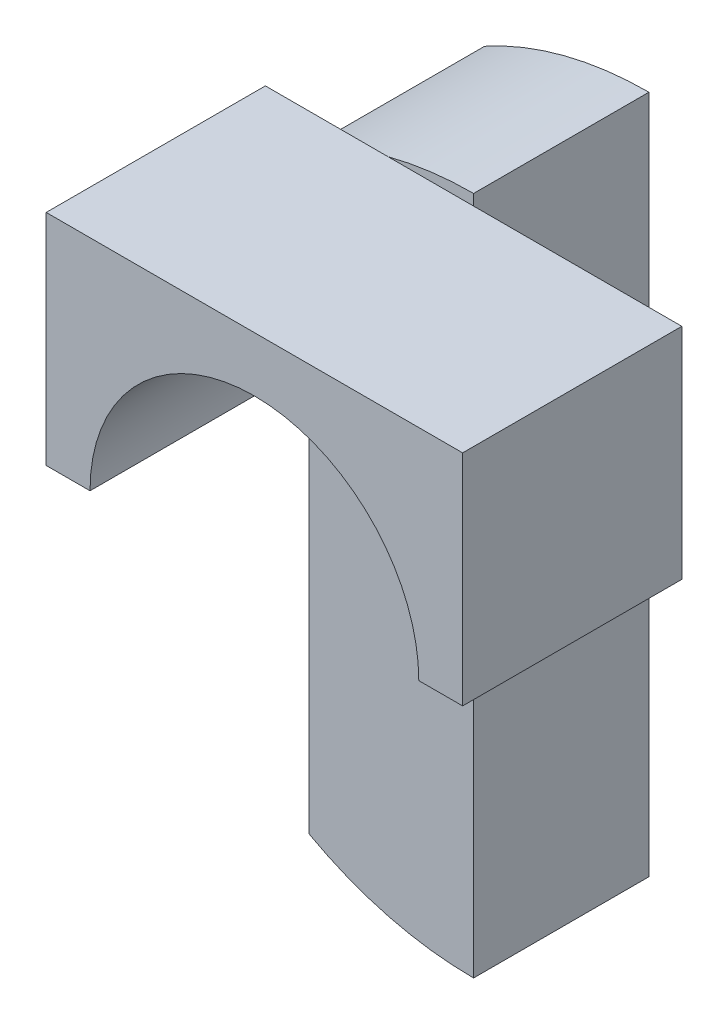
ISO-10303-21;
HEADER;
FILE_DESCRIPTION(('STEP AP214'),'2;1');
FILE_NAME('part.step','',(''),(''),'','','');
FILE_SCHEMA(('AUTOMOTIVE_DESIGN { 1 0 10303 214 1 1 1 1 }'));
ENDSEC;
DATA;
#1=APPLICATION_CONTEXT('core data for automotive mechanical design processes');
#2=APPLICATION_PROTOCOL_DEFINITION('international standard','automotive_design',2000,#1);
#3=PRODUCT_CONTEXT('',#1,'mechanical');
#4=PRODUCT('Part','Part','',(#3));
#5=PRODUCT_RELATED_PRODUCT_CATEGORY('part','',(#4));
#6=PRODUCT_DEFINITION_FORMATION('','',#4);
#7=PRODUCT_DEFINITION_CONTEXT('part definition',#1,'design');
#8=PRODUCT_DEFINITION('design','',#6,#7);
#9=PRODUCT_DEFINITION_SHAPE('','',#8);
#10=(LENGTH_UNIT() NAMED_UNIT(*) SI_UNIT(.MILLI.,.METRE.));
#11=(NAMED_UNIT(*) PLANE_ANGLE_UNIT() SI_UNIT($,.RADIAN.));
#12=(NAMED_UNIT(*) SI_UNIT($,.STERADIAN.) SOLID_ANGLE_UNIT());
#13=UNCERTAINTY_MEASURE_WITH_UNIT(LENGTH_MEASURE(1.E-05),#10,'distance_accuracy_value','');
#14=(GEOMETRIC_REPRESENTATION_CONTEXT(3) GLOBAL_UNCERTAINTY_ASSIGNED_CONTEXT((#13)) GLOBAL_UNIT_ASSIGNED_CONTEXT((#10,
#11,#12)) REPRESENTATION_CONTEXT('',''));
#15=CARTESIAN_POINT('',(0.,0.,0.));
#16=DIRECTION('',(0.,0.,1.));
#17=DIRECTION('',(1.,0.,0.));
#18=AXIS2_PLACEMENT_3D('',#15,#16,#17);
#19=CARTESIAN_POINT('',(0.,0.,8.));
#20=DIRECTION('',(0.,0.,1.));
#21=DIRECTION('',(1.,0.,0.));
#22=AXIS2_PLACEMENT_3D('',#19,#20,#21);
#23=PLANE('',#22);
#24=CARTESIAN_POINT('',(0.,5.,8.));
#25=DIRECTION('',(0.,0.,-1.));
#26=DIRECTION('',(1.,0.,0.));
#27=AXIS2_PLACEMENT_3D('',#24,#25,#26);
#28=CIRCLE('',#27,7.50000000000001);
#29=CARTESIAN_POINT('',(-7.50000000000001,5.,8.));
#30=VERTEX_POINT('',#29);
#31=CARTESIAN_POINT('',(0.,12.5,8.));
#32=VERTEX_POINT('',#31);
#33=EDGE_CURVE('E202',#30,#32,#28,.T.);
#34=ORIENTED_EDGE('',*,*,#33,.F.);
#35=DIRECTION('',(0.,-1.,0.));
#36=VECTOR('',#35,1.);
#37=CARTESIAN_POINT('',(-7.50000000000001,13.5646599662505,8.));
#38=LINE('',#37,#36);
#39=CARTESIAN_POINT('',(-7.50000000000001,-13.5646599662505,8.));
#40=VERTEX_POINT('',#39);
#41=EDGE_CURVE('E158',#30,#40,#38,.T.);
#42=ORIENTED_EDGE('',*,*,#41,.T.);
#43=CARTESIAN_POINT('',(0.,0.,8.));
#44=DIRECTION('',(0.,0.,1.));
#45=DIRECTION('',(1.,0.,0.));
#46=AXIS2_PLACEMENT_3D('',#43,#44,#45);
#47=CIRCLE('',#46,15.5);
#48=CARTESIAN_POINT('',(1.62353882256206E-13,-15.5,8.));
#49=VERTEX_POINT('',#48);
#50=EDGE_CURVE('E163',#40,#49,#47,.T.);
#51=ORIENTED_EDGE('',*,*,#50,.T.);
#52=DIRECTION('',(0.,1.,0.));
#53=VECTOR('',#52,1.);
#54=CARTESIAN_POINT('',(0.,15.5,8.));
#55=LINE('',#54,#53);
#56=EDGE_CURVE('E166',#49,#32,#55,.T.);
#57=ORIENTED_EDGE('',*,*,#56,.T.);
#58=EDGE_LOOP('',(#34,#42,#51,#57));
#59=FACE_BOUND('',#58,.T.);
#60=ADVANCED_FACE('F33',(#59),#23,.T.);
#61=CARTESIAN_POINT('',(0.,0.,8.));
#62=DIRECTION('',(0.,0.,-1.));
#63=DIRECTION('',(-1.,0.,0.));
#64=AXIS2_PLACEMENT_3D('',#61,#62,#63);
#65=CYLINDRICAL_SURFACE('',#64,15.5);
#66=CARTESIAN_POINT('',(0.,0.,0.));
#67=DIRECTION('',(0.,0.,1.));
#68=DIRECTION('',(1.,0.,0.));
#69=AXIS2_PLACEMENT_3D('',#66,#67,#68);
#70=CIRCLE('',#69,15.5);
#71=CARTESIAN_POINT('',(0.,15.5,0.));
#72=VERTEX_POINT('',#71);
#73=CARTESIAN_POINT('',(-7.50000000000001,13.5646599662505,0.));
#74=VERTEX_POINT('',#73);
#75=EDGE_CURVE('E147',#72,#74,#70,.T.);
#76=ORIENTED_EDGE('',*,*,#75,.T.);
#77=DIRECTION('',(0.,0.,-1.));
#78=VECTOR('',#77,1.);
#79=CARTESIAN_POINT('',(-7.50000000000001,13.5646599662505,8.));
#80=LINE('',#79,#78);
#81=CARTESIAN_POINT('',(-7.50000000000001,13.5646599662505,8.));
#82=VERTEX_POINT('',#81);
#83=EDGE_CURVE('E37',#82,#74,#80,.T.);
#84=ORIENTED_EDGE('',*,*,#83,.F.);
#85=CARTESIAN_POINT('',(0.,0.,8.));
#86=DIRECTION('',(0.,0.,1.));
#87=DIRECTION('',(1.,0.,0.));
#88=AXIS2_PLACEMENT_3D('',#85,#86,#87);
#89=CIRCLE('',#88,15.5);
#90=CARTESIAN_POINT('',(-3.90512483795332,15.,8.));
#91=VERTEX_POINT('',#90);
#92=EDGE_CURVE('E159',#91,#82,#89,.T.);
#93=ORIENTED_EDGE('',*,*,#92,.F.);
#94=CARTESIAN_POINT('',(0.,15.5,8.));
#95=VERTEX_POINT('',#94);
#96=EDGE_CURVE('E156',#95,#91,#89,.T.);
#97=ORIENTED_EDGE('',*,*,#96,.F.);
#98=DIRECTION('',(0.,0.,-1.));
#99=VECTOR('',#98,1.);
#100=CARTESIAN_POINT('',(0.,15.5,8.));
#101=LINE('',#100,#99);
#102=EDGE_CURVE('E167',#95,#72,#101,.T.);
#103=ORIENTED_EDGE('',*,*,#102,.T.);
#104=EDGE_LOOP('',(#76,#84,#93,#97,#103));
#105=FACE_BOUND('',#104,.T.);
#106=ADVANCED_FACE('F35',(#105),#65,.T.);
#107=CARTESIAN_POINT('',(-7.50000000000001,13.5646599662505,8.));
#108=DIRECTION('',(1.,0.,0.));
#109=DIRECTION('',(0.,0.,-1.));
#110=AXIS2_PLACEMENT_3D('',#107,#108,#109);
#111=PLANE('',#110);
#112=DIRECTION('',(0.,-1.,0.));
#113=VECTOR('',#112,1.);
#114=CARTESIAN_POINT('',(-7.50000000000001,13.5646599662505,0.));
#115=LINE('',#114,#113);
#116=CARTESIAN_POINT('',(-7.50000000000001,-13.5646599662505,0.));
#117=VERTEX_POINT('',#116);
#118=EDGE_CURVE('E150',#74,#117,#115,.T.);
#119=ORIENTED_EDGE('',*,*,#118,.T.);
#120=DIRECTION('',(0.,0.,-1.));
#121=VECTOR('',#120,1.);
#122=CARTESIAN_POINT('',(-7.50000000000001,-13.5646599662505,8.));
#123=LINE('',#122,#121);
#124=EDGE_CURVE('E178',#40,#117,#123,.T.);
#125=ORIENTED_EDGE('',*,*,#124,.F.);
#126=ORIENTED_EDGE('',*,*,#41,.F.);
#127=EDGE_CURVE('E160',#82,#30,#38,.T.);
#128=ORIENTED_EDGE('',*,*,#127,.F.);
#129=ORIENTED_EDGE('',*,*,#83,.T.);
#130=EDGE_LOOP('',(#119,#125,#126,#128,#129));
#131=FACE_BOUND('',#130,.T.);
#132=ADVANCED_FACE('F187',(#131),#111,.F.);
#133=CARTESIAN_POINT('',(0.,0.,8.));
#134=DIRECTION('',(0.,0.,-1.));
#135=DIRECTION('',(-1.,0.,0.));
#136=AXIS2_PLACEMENT_3D('',#133,#134,#135);
#137=CYLINDRICAL_SURFACE('',#136,15.5);
#138=CARTESIAN_POINT('',(0.,0.,0.));
#139=DIRECTION('',(0.,0.,1.));
#140=DIRECTION('',(1.,0.,0.));
#141=AXIS2_PLACEMENT_3D('',#138,#139,#140);
#142=CIRCLE('',#141,15.5);
#143=CARTESIAN_POINT('',(1.62353882256206E-13,-15.5,0.));
#144=VERTEX_POINT('',#143);
#145=EDGE_CURVE('E170',#117,#144,#142,.T.);
#146=ORIENTED_EDGE('',*,*,#145,.T.);
#147=DIRECTION('',(0.,0.,-1.));
#148=VECTOR('',#147,1.);
#149=CARTESIAN_POINT('',(1.62353882256206E-13,-15.5,8.));
#150=LINE('',#149,#148);
#151=EDGE_CURVE('E176',#49,#144,#150,.T.);
#152=ORIENTED_EDGE('',*,*,#151,.F.);
#153=ORIENTED_EDGE('',*,*,#50,.F.);
#154=ORIENTED_EDGE('',*,*,#124,.T.);
#155=EDGE_LOOP('',(#146,#152,#153,#154));
#156=FACE_BOUND('',#155,.T.);
#157=ADVANCED_FACE('F199',(#156),#137,.T.);
#158=CARTESIAN_POINT('',(0.,15.5,8.));
#159=DIRECTION('',(-1.,0.,0.));
#160=DIRECTION('',(0.,-1.,0.));
#161=AXIS2_PLACEMENT_3D('',#158,#159,#160);
#162=PLANE('',#161);
#163=DIRECTION('',(0.,1.,0.));
#164=VECTOR('',#163,1.);
#165=CARTESIAN_POINT('',(0.,15.5,0.));
#166=LINE('',#165,#164);
#167=EDGE_CURVE('E172',#144,#72,#166,.T.);
#168=ORIENTED_EDGE('',*,*,#167,.T.);
#169=ORIENTED_EDGE('',*,*,#102,.F.);
#170=CARTESIAN_POINT('',(0.,15.,8.));
#171=VERTEX_POINT('',#170);
#172=EDGE_CURVE('E165',#171,#95,#55,.T.);
#173=ORIENTED_EDGE('',*,*,#172,.F.);
#174=EDGE_CURVE('E56',#32,#171,#55,.T.);
#175=ORIENTED_EDGE('',*,*,#174,.F.);
#176=ORIENTED_EDGE('',*,*,#56,.F.);
#177=ORIENTED_EDGE('',*,*,#151,.T.);
#178=EDGE_LOOP('',(#168,#169,#173,#175,#176,#177));
#179=FACE_BOUND('',#178,.T.);
#180=ADVANCED_FACE('F200',(#179),#162,.F.);
#181=DIRECTION('',(-1.,0.,0.));
#182=VECTOR('',#181,1.);
#183=CARTESIAN_POINT('',(9.50000000000001,15.,8.));
#184=LINE('',#183,#182);
#185=EDGE_CURVE('E11',#171,#91,#184,.T.);
#186=ORIENTED_EDGE('',*,*,#185,.F.);
#187=ORIENTED_EDGE('',*,*,#172,.T.);
#188=ORIENTED_EDGE('',*,*,#96,.T.);
#189=EDGE_LOOP('',(#186,#187,#188));
#190=FACE_BOUND('',#189,.T.);
#191=ADVANCED_FACE('F250',(#190),#23,.T.);
#192=CARTESIAN_POINT('',(0.,0.,0.));
#193=DIRECTION('',(0.,0.,1.));
#194=DIRECTION('',(1.,0.,0.));
#195=AXIS2_PLACEMENT_3D('',#192,#193,#194);
#196=PLANE('',#195);
#197=ORIENTED_EDGE('',*,*,#75,.F.);
#198=ORIENTED_EDGE('',*,*,#167,.F.);
#199=ORIENTED_EDGE('',*,*,#145,.F.);
#200=ORIENTED_EDGE('',*,*,#118,.F.);
#201=EDGE_LOOP('',(#197,#198,#199,#200));
#202=FACE_BOUND('',#201,.T.);
#203=ADVANCED_FACE('F197',(#202),#196,.F.);
#204=CARTESIAN_POINT('',(0.,5.,8.));
#205=DIRECTION('',(0.,0.,1.));
#206=DIRECTION('',(1.,0.,0.));
#207=AXIS2_PLACEMENT_3D('',#204,#205,#206);
#208=PLANE('',#207);
#209=CARTESIAN_POINT('',(-9.5,15.,8.));
#210=VERTEX_POINT('',#209);
#211=EDGE_CURVE('E44',#91,#210,#184,.T.);
#212=ORIENTED_EDGE('',*,*,#211,.F.);
#213=ORIENTED_EDGE('',*,*,#92,.T.);
#214=ORIENTED_EDGE('',*,*,#127,.T.);
#215=DIRECTION('',(1.,0.,0.));
#216=VECTOR('',#215,1.);
#217=CARTESIAN_POINT('',(-7.50000000000001,5.,8.));
#218=LINE('',#217,#216);
#219=CARTESIAN_POINT('',(-9.50000000000001,5.,8.));
#220=VERTEX_POINT('',#219);
#221=EDGE_CURVE('E140',#220,#30,#218,.T.);
#222=ORIENTED_EDGE('',*,*,#221,.F.);
#223=DIRECTION('',(0.,-1.,0.));
#224=VECTOR('',#223,1.);
#225=CARTESIAN_POINT('',(-9.50000000000001,5.,8.));
#226=LINE('',#225,#224);
#227=EDGE_CURVE('E217',#210,#220,#226,.T.);
#228=ORIENTED_EDGE('',*,*,#227,.F.);
#229=EDGE_LOOP('',(#212,#213,#214,#222,#228));
#230=FACE_BOUND('',#229,.T.);
#231=ADVANCED_FACE('F249',(#230),#208,.F.);
#232=CARTESIAN_POINT('',(7.50000000000001,5.,8.));
#233=VERTEX_POINT('',#232);
#234=EDGE_CURVE('E145',#32,#233,#28,.T.);
#235=ORIENTED_EDGE('',*,*,#234,.F.);
#236=ORIENTED_EDGE('',*,*,#174,.T.);
#237=CARTESIAN_POINT('',(9.50000000000001,15.,8.));
#238=VERTEX_POINT('',#237);
#239=EDGE_CURVE('E43',#238,#171,#184,.T.);
#240=ORIENTED_EDGE('',*,*,#239,.F.);
#241=DIRECTION('',(0.,1.,0.));
#242=VECTOR('',#241,1.);
#243=CARTESIAN_POINT('',(9.50000000000001,5.,8.));
#244=LINE('',#243,#242);
#245=CARTESIAN_POINT('',(9.50000000000001,5.,8.));
#246=VERTEX_POINT('',#245);
#247=EDGE_CURVE('E211',#246,#238,#244,.T.);
#248=ORIENTED_EDGE('',*,*,#247,.F.);
#249=DIRECTION('',(1.,0.,0.));
#250=VECTOR('',#249,1.);
#251=CARTESIAN_POINT('',(7.50000000000001,5.,8.));
#252=LINE('',#251,#250);
#253=EDGE_CURVE('E208',#233,#246,#252,.T.);
#254=ORIENTED_EDGE('',*,*,#253,.F.);
#255=EDGE_LOOP('',(#235,#236,#240,#248,#254));
#256=FACE_BOUND('',#255,.T.);
#257=ADVANCED_FACE('F204',(#256),#208,.F.);
#258=CARTESIAN_POINT('',(0.,5.,18.));
#259=DIRECTION('',(0.,0.,-1.));
#260=DIRECTION('',(-1.,0.,0.));
#261=AXIS2_PLACEMENT_3D('',#258,#259,#260);
#262=CYLINDRICAL_SURFACE('',#261,7.50000000000001);
#263=ORIENTED_EDGE('',*,*,#33,.T.);
#264=ORIENTED_EDGE('',*,*,#234,.T.);
#265=DIRECTION('',(0.,0.,-1.));
#266=VECTOR('',#265,1.);
#267=CARTESIAN_POINT('',(7.50000000000001,5.,18.));
#268=LINE('',#267,#266);
#269=CARTESIAN_POINT('',(7.50000000000001,5.,18.));
#270=VERTEX_POINT('',#269);
#271=EDGE_CURVE('E125',#270,#233,#268,.T.);
#272=ORIENTED_EDGE('',*,*,#271,.F.);
#273=CARTESIAN_POINT('',(0.,5.,18.));
#274=DIRECTION('',(0.,0.,-1.));
#275=DIRECTION('',(1.,0.,0.));
#276=AXIS2_PLACEMENT_3D('',#273,#274,#275);
#277=CIRCLE('',#276,7.50000000000001);
#278=CARTESIAN_POINT('',(-7.50000000000001,5.,18.));
#279=VERTEX_POINT('',#278);
#280=EDGE_CURVE('E131',#279,#270,#277,.T.);
#281=ORIENTED_EDGE('',*,*,#280,.F.);
#282=DIRECTION('',(0.,0.,-1.));
#283=VECTOR('',#282,1.);
#284=CARTESIAN_POINT('',(-7.50000000000001,5.,18.));
#285=LINE('',#284,#283);
#286=EDGE_CURVE('E210',#279,#30,#285,.T.);
#287=ORIENTED_EDGE('',*,*,#286,.T.);
#288=EDGE_LOOP('',(#263,#264,#272,#281,#287));
#289=FACE_BOUND('',#288,.T.);
#290=ADVANCED_FACE('F143',(#289),#262,.F.);
#291=CARTESIAN_POINT('',(7.50000000000001,5.,18.));
#292=DIRECTION('',(0.,1.,0.));
#293=DIRECTION('',(0.,0.,1.));
#294=AXIS2_PLACEMENT_3D('',#291,#292,#293);
#295=PLANE('',#294);
#296=ORIENTED_EDGE('',*,*,#253,.T.);
#297=DIRECTION('',(0.,0.,-1.));
#298=VECTOR('',#297,1.);
#299=CARTESIAN_POINT('',(9.50000000000001,5.,18.));
#300=LINE('',#299,#298);
#301=CARTESIAN_POINT('',(9.50000000000001,5.,18.));
#302=VERTEX_POINT('',#301);
#303=EDGE_CURVE('E127',#302,#246,#300,.T.);
#304=ORIENTED_EDGE('',*,*,#303,.F.);
#305=DIRECTION('',(1.,0.,0.));
#306=VECTOR('',#305,1.);
#307=CARTESIAN_POINT('',(7.50000000000001,5.,18.));
#308=LINE('',#307,#306);
#309=EDGE_CURVE('E121',#270,#302,#308,.T.);
#310=ORIENTED_EDGE('',*,*,#309,.F.);
#311=ORIENTED_EDGE('',*,*,#271,.T.);
#312=EDGE_LOOP('',(#296,#304,#310,#311));
#313=FACE_BOUND('',#312,.T.);
#314=ADVANCED_FACE('F123',(#313),#295,.F.);
#315=CARTESIAN_POINT('',(9.50000000000001,5.,18.));
#316=DIRECTION('',(-1.,0.,0.));
#317=DIRECTION('',(0.,0.,1.));
#318=AXIS2_PLACEMENT_3D('',#315,#316,#317);
#319=PLANE('',#318);
#320=ORIENTED_EDGE('',*,*,#247,.T.);
#321=DIRECTION('',(0.,0.,-1.));
#322=VECTOR('',#321,1.);
#323=CARTESIAN_POINT('',(9.50000000000001,15.,18.));
#324=LINE('',#323,#322);
#325=CARTESIAN_POINT('',(9.50000000000001,15.,18.));
#326=VERTEX_POINT('',#325);
#327=EDGE_CURVE('E152',#326,#238,#324,.T.);
#328=ORIENTED_EDGE('',*,*,#327,.F.);
#329=DIRECTION('',(0.,1.,0.));
#330=VECTOR('',#329,1.);
#331=CARTESIAN_POINT('',(9.50000000000001,5.,18.));
#332=LINE('',#331,#330);
#333=EDGE_CURVE('E130',#302,#326,#332,.T.);
#334=ORIENTED_EDGE('',*,*,#333,.F.);
#335=ORIENTED_EDGE('',*,*,#303,.T.);
#336=EDGE_LOOP('',(#320,#328,#334,#335));
#337=FACE_BOUND('',#336,.T.);
#338=ADVANCED_FACE('F235',(#337),#319,.F.);
#339=CARTESIAN_POINT('',(9.50000000000001,15.,18.));
#340=DIRECTION('',(0.,-1.,0.));
#341=DIRECTION('',(1.,0.,0.));
#342=AXIS2_PLACEMENT_3D('',#339,#340,#341);
#343=PLANE('',#342);
#344=ORIENTED_EDGE('',*,*,#239,.T.);
#345=ORIENTED_EDGE('',*,*,#185,.T.);
#346=ORIENTED_EDGE('',*,*,#211,.T.);
#347=DIRECTION('',(0.,0.,-1.));
#348=VECTOR('',#347,1.);
#349=CARTESIAN_POINT('',(-9.5,15.,18.));
#350=LINE('',#349,#348);
#351=CARTESIAN_POINT('',(-9.5,15.,18.));
#352=VERTEX_POINT('',#351);
#353=EDGE_CURVE('E225',#352,#210,#350,.T.);
#354=ORIENTED_EDGE('',*,*,#353,.F.);
#355=DIRECTION('',(-1.,0.,0.));
#356=VECTOR('',#355,1.);
#357=CARTESIAN_POINT('',(9.50000000000001,15.,18.));
#358=LINE('',#357,#356);
#359=EDGE_CURVE('E233',#326,#352,#358,.T.);
#360=ORIENTED_EDGE('',*,*,#359,.F.);
#361=ORIENTED_EDGE('',*,*,#327,.T.);
#362=EDGE_LOOP('',(#344,#345,#346,#354,#360,#361));
#363=FACE_BOUND('',#362,.T.);
#364=ADVANCED_FACE('F231',(#363),#343,.F.);
#365=CARTESIAN_POINT('',(-9.50000000000001,5.,18.));
#366=DIRECTION('',(1.,0.,0.));
#367=DIRECTION('',(0.,1.,0.));
#368=AXIS2_PLACEMENT_3D('',#365,#366,#367);
#369=PLANE('',#368);
#370=ORIENTED_EDGE('',*,*,#227,.T.);
#371=DIRECTION('',(0.,0.,-1.));
#372=VECTOR('',#371,1.);
#373=CARTESIAN_POINT('',(-9.50000000000001,5.,18.));
#374=LINE('',#373,#372);
#375=CARTESIAN_POINT('',(-9.50000000000001,5.,18.));
#376=VERTEX_POINT('',#375);
#377=EDGE_CURVE('E222',#376,#220,#374,.T.);
#378=ORIENTED_EDGE('',*,*,#377,.F.);
#379=DIRECTION('',(0.,-1.,0.));
#380=VECTOR('',#379,1.);
#381=CARTESIAN_POINT('',(-9.50000000000001,5.,18.));
#382=LINE('',#381,#380);
#383=EDGE_CURVE('E237',#352,#376,#382,.T.);
#384=ORIENTED_EDGE('',*,*,#383,.F.);
#385=ORIENTED_EDGE('',*,*,#353,.T.);
#386=EDGE_LOOP('',(#370,#378,#384,#385));
#387=FACE_BOUND('',#386,.T.);
#388=ADVANCED_FACE('F242',(#387),#369,.F.);
#389=CARTESIAN_POINT('',(-7.50000000000001,5.,18.));
#390=DIRECTION('',(0.,1.,0.));
#391=DIRECTION('',(-1.,0.,0.));
#392=AXIS2_PLACEMENT_3D('',#389,#390,#391);
#393=PLANE('',#392);
#394=ORIENTED_EDGE('',*,*,#221,.T.);
#395=ORIENTED_EDGE('',*,*,#286,.F.);
#396=DIRECTION('',(1.,0.,0.));
#397=VECTOR('',#396,1.);
#398=CARTESIAN_POINT('',(-7.50000000000001,5.,18.));
#399=LINE('',#398,#397);
#400=EDGE_CURVE('E136',#376,#279,#399,.T.);
#401=ORIENTED_EDGE('',*,*,#400,.F.);
#402=ORIENTED_EDGE('',*,*,#377,.T.);
#403=EDGE_LOOP('',(#394,#395,#401,#402));
#404=FACE_BOUND('',#403,.T.);
#405=ADVANCED_FACE('F246',(#404),#393,.F.);
#406=CARTESIAN_POINT('',(0.,5.,18.));
#407=DIRECTION('',(0.,0.,1.));
#408=DIRECTION('',(1.,0.,0.));
#409=AXIS2_PLACEMENT_3D('',#406,#407,#408);
#410=PLANE('',#409);
#411=ORIENTED_EDGE('',*,*,#280,.T.);
#412=ORIENTED_EDGE('',*,*,#309,.T.);
#413=ORIENTED_EDGE('',*,*,#333,.T.);
#414=ORIENTED_EDGE('',*,*,#359,.T.);
#415=ORIENTED_EDGE('',*,*,#383,.T.);
#416=ORIENTED_EDGE('',*,*,#400,.T.);
#417=EDGE_LOOP('',(#411,#412,#413,#414,#415,#416));
#418=FACE_BOUND('',#417,.T.);
#419=ADVANCED_FACE('F134',(#418),#410,.T.);
#420=CLOSED_SHELL('',(#60,#106,#132,#157,#180,#191,#203,#231,#257,#290,#314,#338,#364,#388,#405,#419));
#421=MANIFOLD_SOLID_BREP('B2',#420);
#422=ADVANCED_BREP_SHAPE_REPRESENTATION('',(#18,#421),#14);
#423=SHAPE_DEFINITION_REPRESENTATION(#9,#422);
ENDSEC;
END-ISO-10303-21;
